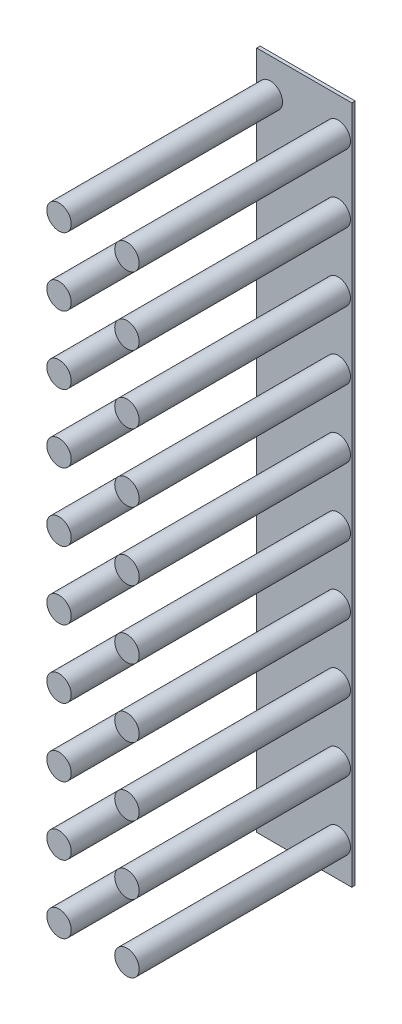
ISO-10303-21;
HEADER;
FILE_DESCRIPTION(('STEP AP214'),'2;1');
FILE_NAME('part.step','',(''),(''),'','','');
FILE_SCHEMA(('AUTOMOTIVE_DESIGN { 1 0 10303 214 1 1 1 1 }'));
ENDSEC;
DATA;
#1=APPLICATION_CONTEXT('core data for automotive mechanical design processes');
#2=APPLICATION_PROTOCOL_DEFINITION('international standard','automotive_design',2000,#1);
#3=PRODUCT_CONTEXT('',#1,'mechanical');
#4=PRODUCT('Part','Part','',(#3));
#5=PRODUCT_RELATED_PRODUCT_CATEGORY('part','',(#4));
#6=PRODUCT_DEFINITION_FORMATION('','',#4);
#7=PRODUCT_DEFINITION_CONTEXT('part definition',#1,'design');
#8=PRODUCT_DEFINITION('design','',#6,#7);
#9=PRODUCT_DEFINITION_SHAPE('','',#8);
#10=(LENGTH_UNIT() NAMED_UNIT(*) SI_UNIT(.MILLI.,.METRE.));
#11=(NAMED_UNIT(*) PLANE_ANGLE_UNIT() SI_UNIT($,.RADIAN.));
#12=(NAMED_UNIT(*) SI_UNIT($,.STERADIAN.) SOLID_ANGLE_UNIT());
#13=UNCERTAINTY_MEASURE_WITH_UNIT(LENGTH_MEASURE(1.E-05),#10,'distance_accuracy_value','');
#14=(GEOMETRIC_REPRESENTATION_CONTEXT(3) GLOBAL_UNCERTAINTY_ASSIGNED_CONTEXT((#13)) GLOBAL_UNIT_ASSIGNED_CONTEXT((#10,
#11,#12)) REPRESENTATION_CONTEXT('',''));
#15=CARTESIAN_POINT('',(0.,0.,0.));
#16=DIRECTION('',(0.,0.,1.));
#17=DIRECTION('',(1.,0.,0.));
#18=AXIS2_PLACEMENT_3D('',#15,#16,#17);
#19=CARTESIAN_POINT('',(19.999999551506,-6.5999998852E-07,4.8387));
#20=DIRECTION('',(4.371138828674E-08,0.,0.999999999999999));
#21=DIRECTION('',(0.999999999999999,0.,-4.371138828674E-08));
#22=AXIS2_PLACEMENT_3D('',#19,#20,#21);
#23=PLANE('',#22);
#24=CARTESIAN_POINT('',(20.6349998013166,-5.715000632243,4.83869997224342));
#25=DIRECTION('',(-4.371138828674E-08,0.,-0.999999999999999));
#26=DIRECTION('',(-0.999999999999999,0.,4.371138828674E-08));
#27=AXIS2_PLACEMENT_3D('',#24,#25,#26);
#28=CIRCLE('',#27,0.2286);
#29=CARTESIAN_POINT('',(20.4063998013166,-5.715000632243,4.83869998223585));
#30=VERTEX_POINT('',#29);
#31=EDGE_CURVE('E20',#30,#30,#28,.T.);
#32=ORIENTED_EDGE('',*,*,#31,.F.);
#33=EDGE_LOOP('',(#32));
#34=FACE_BOUND('',#33,.T.);
#35=ADVANCED_FACE('F17',(#34),#23,.T.);
#36=CARTESIAN_POINT('',(19.999999551506,-6.5999998852E-07,4.8387));
#37=DIRECTION('',(4.371138828674E-08,0.,0.999999999999999));
#38=DIRECTION('',(0.999999999999999,0.,-4.371138828674E-08));
#39=AXIS2_PLACEMENT_3D('',#36,#37,#38);
#40=PLANE('',#39);
#41=CARTESIAN_POINT('',(19.3649998013166,-5.715000687757,4.83870002775642));
#42=DIRECTION('',(-4.371138828674E-08,0.,-0.999999999999999));
#43=DIRECTION('',(-0.999999999999999,0.,4.371138828674E-08));
#44=AXIS2_PLACEMENT_3D('',#41,#42,#43);
#45=CIRCLE('',#44,0.2286);
#46=CARTESIAN_POINT('',(19.1363998013166,-5.715000687757,4.83870003774885));
#47=VERTEX_POINT('',#46);
#48=EDGE_CURVE('E195',#47,#47,#45,.T.);
#49=ORIENTED_EDGE('',*,*,#48,.F.);
#50=EDGE_LOOP('',(#49));
#51=FACE_BOUND('',#50,.T.);
#52=ADVANCED_FACE('F205',(#51),#40,.T.);
#53=CARTESIAN_POINT('',(19.999999551506,-6.5999998852E-07,4.8387));
#54=DIRECTION('',(4.371138828674E-08,0.,0.999999999999999));
#55=DIRECTION('',(0.999999999999999,0.,-4.371138828674E-08));
#56=AXIS2_PLACEMENT_3D('',#53,#54,#55);
#57=PLANE('',#56);
#58=CARTESIAN_POINT('',(20.6349997458036,-4.445000632243,4.83869997224342));
#59=DIRECTION('',(-4.371138828674E-08,0.,-0.999999999999999));
#60=DIRECTION('',(-0.999999999999999,0.,4.371138828674E-08));
#61=AXIS2_PLACEMENT_3D('',#58,#59,#60);
#62=CIRCLE('',#61,0.2286);
#63=CARTESIAN_POINT('',(20.4063997458036,-4.445000632243,4.83869998223585));
#64=VERTEX_POINT('',#63);
#65=EDGE_CURVE('E193',#64,#64,#62,.T.);
#66=ORIENTED_EDGE('',*,*,#65,.F.);
#67=EDGE_LOOP('',(#66));
#68=FACE_BOUND('',#67,.T.);
#69=ADVANCED_FACE('F210',(#68),#57,.T.);
#70=CARTESIAN_POINT('',(19.999999551506,-6.5999998852E-07,4.8387));
#71=DIRECTION('',(4.371138828674E-08,0.,0.999999999999999));
#72=DIRECTION('',(0.999999999999999,0.,-4.371138828674E-08));
#73=AXIS2_PLACEMENT_3D('',#70,#71,#72);
#74=PLANE('',#73);
#75=CARTESIAN_POINT('',(19.3649997458036,-4.445000687757,4.83870002775642));
#76=DIRECTION('',(-4.371138828674E-08,0.,-0.999999999999999));
#77=DIRECTION('',(-0.999999999999999,0.,4.371138828674E-08));
#78=AXIS2_PLACEMENT_3D('',#75,#76,#77);
#79=CIRCLE('',#78,0.2286);
#80=CARTESIAN_POINT('',(19.1363997458036,-4.445000687757,4.83870003774885));
#81=VERTEX_POINT('',#80);
#82=EDGE_CURVE('E190',#81,#81,#79,.T.);
#83=ORIENTED_EDGE('',*,*,#82,.F.);
#84=EDGE_LOOP('',(#83));
#85=FACE_BOUND('',#84,.T.);
#86=ADVANCED_FACE('F375',(#85),#74,.T.);
#87=CARTESIAN_POINT('',(19.999999551506,-6.5999998852E-07,4.8387));
#88=DIRECTION('',(4.371138828674E-08,0.,0.999999999999999));
#89=DIRECTION('',(0.999999999999999,0.,-4.371138828674E-08));
#90=AXIS2_PLACEMENT_3D('',#87,#88,#89);
#91=PLANE('',#90);
#92=CARTESIAN_POINT('',(20.6349996902896,-3.175000632243,4.83869997224342));
#93=DIRECTION('',(-4.371138828674E-08,0.,-0.999999999999999));
#94=DIRECTION('',(-0.999999999999999,0.,4.371138828674E-08));
#95=AXIS2_PLACEMENT_3D('',#92,#93,#94);
#96=CIRCLE('',#95,0.2286);
#97=CARTESIAN_POINT('',(20.4063996902896,-3.175000632243,4.83869998223585));
#98=VERTEX_POINT('',#97);
#99=EDGE_CURVE('E187',#98,#98,#96,.T.);
#100=ORIENTED_EDGE('',*,*,#99,.F.);
#101=EDGE_LOOP('',(#100));
#102=FACE_BOUND('',#101,.T.);
#103=ADVANCED_FACE('F371',(#102),#91,.T.);
#104=CARTESIAN_POINT('',(19.999999551506,-6.5999998852E-07,4.8387));
#105=DIRECTION('',(4.371138828674E-08,0.,0.999999999999999));
#106=DIRECTION('',(0.999999999999999,0.,-4.371138828674E-08));
#107=AXIS2_PLACEMENT_3D('',#104,#105,#106);
#108=PLANE('',#107);
#109=CARTESIAN_POINT('',(19.3649996902896,-3.175000687757,4.83870002775642));
#110=DIRECTION('',(-4.371138828674E-08,0.,-0.999999999999999));
#111=DIRECTION('',(-0.999999999999999,0.,4.371138828674E-08));
#112=AXIS2_PLACEMENT_3D('',#109,#110,#111);
#113=CIRCLE('',#112,0.2286);
#114=CARTESIAN_POINT('',(19.1363996902896,-3.175000687757,4.83870003774885));
#115=VERTEX_POINT('',#114);
#116=EDGE_CURVE('E184',#115,#115,#113,.T.);
#117=ORIENTED_EDGE('',*,*,#116,.F.);
#118=EDGE_LOOP('',(#117));
#119=FACE_BOUND('',#118,.T.);
#120=ADVANCED_FACE('F367',(#119),#108,.T.);
#121=CARTESIAN_POINT('',(19.999999551506,-6.5999998852E-07,4.8387));
#122=DIRECTION('',(4.371138828674E-08,0.,0.999999999999999));
#123=DIRECTION('',(0.999999999999999,0.,-4.371138828674E-08));
#124=AXIS2_PLACEMENT_3D('',#121,#122,#123);
#125=PLANE('',#124);
#126=CARTESIAN_POINT('',(20.6349996347766,-1.905000632243,4.83869997224342));
#127=DIRECTION('',(-4.371138828674E-08,0.,-0.999999999999999));
#128=DIRECTION('',(-0.999999999999999,0.,4.371138828674E-08));
#129=AXIS2_PLACEMENT_3D('',#126,#127,#128);
#130=CIRCLE('',#129,0.2286);
#131=CARTESIAN_POINT('',(20.4063996347766,-1.905000632243,4.83869998223585));
#132=VERTEX_POINT('',#131);
#133=EDGE_CURVE('E181',#132,#132,#130,.T.);
#134=ORIENTED_EDGE('',*,*,#133,.F.);
#135=EDGE_LOOP('',(#134));
#136=FACE_BOUND('',#135,.T.);
#137=ADVANCED_FACE('F363',(#136),#125,.T.);
#138=CARTESIAN_POINT('',(19.999999551506,-6.5999998852E-07,4.8387));
#139=DIRECTION('',(4.371138828674E-08,0.,0.999999999999999));
#140=DIRECTION('',(0.999999999999999,0.,-4.371138828674E-08));
#141=AXIS2_PLACEMENT_3D('',#138,#139,#140);
#142=PLANE('',#141);
#143=CARTESIAN_POINT('',(19.3649996347766,-1.905000687757,4.83870002775642));
#144=DIRECTION('',(-4.371138828674E-08,0.,-0.999999999999999));
#145=DIRECTION('',(-0.999999999999999,0.,4.371138828674E-08));
#146=AXIS2_PLACEMENT_3D('',#143,#144,#145);
#147=CIRCLE('',#146,0.2286);
#148=CARTESIAN_POINT('',(19.1363996347766,-1.905000687757,4.83870003774885));
#149=VERTEX_POINT('',#148);
#150=EDGE_CURVE('E178',#149,#149,#147,.T.);
#151=ORIENTED_EDGE('',*,*,#150,.F.);
#152=EDGE_LOOP('',(#151));
#153=FACE_BOUND('',#152,.T.);
#154=ADVANCED_FACE('F359',(#153),#142,.T.);
#155=CARTESIAN_POINT('',(19.999999551506,-6.5999998852E-07,4.8387));
#156=DIRECTION('',(4.371138828674E-08,0.,0.999999999999999));
#157=DIRECTION('',(0.999999999999999,0.,-4.371138828674E-08));
#158=AXIS2_PLACEMENT_3D('',#155,#156,#157);
#159=PLANE('',#158);
#160=CARTESIAN_POINT('',(20.6349995792626,-0.635000632243003,4.83869997224342));
#161=DIRECTION('',(-4.371138828674E-08,0.,-0.999999999999999));
#162=DIRECTION('',(-0.999999999999999,0.,4.371138828674E-08));
#163=AXIS2_PLACEMENT_3D('',#160,#161,#162);
#164=CIRCLE('',#163,0.2286);
#165=CARTESIAN_POINT('',(20.4063995792626,-0.635000632243003,4.83869998223585));
#166=VERTEX_POINT('',#165);
#167=EDGE_CURVE('E175',#166,#166,#164,.T.);
#168=ORIENTED_EDGE('',*,*,#167,.F.);
#169=EDGE_LOOP('',(#168));
#170=FACE_BOUND('',#169,.T.);
#171=ADVANCED_FACE('F355',(#170),#159,.T.);
#172=CARTESIAN_POINT('',(19.999999551506,-6.5999998852E-07,4.8387));
#173=DIRECTION('',(4.371138828674E-08,0.,0.999999999999999));
#174=DIRECTION('',(0.999999999999999,0.,-4.371138828674E-08));
#175=AXIS2_PLACEMENT_3D('',#172,#173,#174);
#176=PLANE('',#175);
#177=CARTESIAN_POINT('',(19.3649995792626,-0.635000687757003,4.83870002775642));
#178=DIRECTION('',(-4.371138828674E-08,0.,-0.999999999999999));
#179=DIRECTION('',(-0.999999999999999,0.,4.371138828674E-08));
#180=AXIS2_PLACEMENT_3D('',#177,#178,#179);
#181=CIRCLE('',#180,0.2286);
#182=CARTESIAN_POINT('',(19.1363995792626,-0.635000687757003,4.83870003774885));
#183=VERTEX_POINT('',#182);
#184=EDGE_CURVE('E172',#183,#183,#181,.T.);
#185=ORIENTED_EDGE('',*,*,#184,.F.);
#186=EDGE_LOOP('',(#185));
#187=FACE_BOUND('',#186,.T.);
#188=ADVANCED_FACE('F351',(#187),#176,.T.);
#189=CARTESIAN_POINT('',(19.999999551506,-6.5999998852E-07,4.8387));
#190=DIRECTION('',(4.371138828674E-08,0.,0.999999999999999));
#191=DIRECTION('',(0.999999999999999,0.,-4.371138828674E-08));
#192=AXIS2_PLACEMENT_3D('',#189,#190,#191);
#193=PLANE('',#192);
#194=CARTESIAN_POINT('',(20.6349995237496,0.634999367756997,4.83869997224342));
#195=DIRECTION('',(-4.371138828674E-08,0.,-0.999999999999999));
#196=DIRECTION('',(-0.999999999999999,0.,4.371138828674E-08));
#197=AXIS2_PLACEMENT_3D('',#194,#195,#196);
#198=CIRCLE('',#197,0.2286);
#199=CARTESIAN_POINT('',(20.4063995237496,0.634999367756997,4.83869998223585));
#200=VERTEX_POINT('',#199);
#201=EDGE_CURVE('E169',#200,#200,#198,.T.);
#202=ORIENTED_EDGE('',*,*,#201,.F.);
#203=EDGE_LOOP('',(#202));
#204=FACE_BOUND('',#203,.T.);
#205=ADVANCED_FACE('F347',(#204),#193,.T.);
#206=CARTESIAN_POINT('',(19.999999551506,-6.5999998852E-07,4.8387));
#207=DIRECTION('',(4.371138828674E-08,0.,0.999999999999999));
#208=DIRECTION('',(0.999999999999999,0.,-4.371138828674E-08));
#209=AXIS2_PLACEMENT_3D('',#206,#207,#208);
#210=PLANE('',#209);
#211=CARTESIAN_POINT('',(19.3649995237496,0.634999312242997,4.83870002775642));
#212=DIRECTION('',(-4.371138828674E-08,0.,-0.999999999999999));
#213=DIRECTION('',(-0.999999999999999,0.,4.371138828674E-08));
#214=AXIS2_PLACEMENT_3D('',#211,#212,#213);
#215=CIRCLE('',#214,0.2286);
#216=CARTESIAN_POINT('',(19.1363995237496,0.634999312242997,4.83870003774885));
#217=VERTEX_POINT('',#216);
#218=EDGE_CURVE('E166',#217,#217,#215,.T.);
#219=ORIENTED_EDGE('',*,*,#218,.F.);
#220=EDGE_LOOP('',(#219));
#221=FACE_BOUND('',#220,.T.);
#222=ADVANCED_FACE('F343',(#221),#210,.T.);
#223=CARTESIAN_POINT('',(19.999999551506,-6.5999998852E-07,4.8387));
#224=DIRECTION('',(4.371138828674E-08,0.,0.999999999999999));
#225=DIRECTION('',(0.999999999999999,0.,-4.371138828674E-08));
#226=AXIS2_PLACEMENT_3D('',#223,#224,#225);
#227=PLANE('',#226);
#228=CARTESIAN_POINT('',(20.6349994682356,1.904999367757,4.83869997224342));
#229=DIRECTION('',(-4.371138828674E-08,0.,-0.999999999999999));
#230=DIRECTION('',(-0.999999999999999,0.,4.371138828674E-08));
#231=AXIS2_PLACEMENT_3D('',#228,#229,#230);
#232=CIRCLE('',#231,0.2286);
#233=CARTESIAN_POINT('',(20.4063994682356,1.904999367757,4.83869998223585));
#234=VERTEX_POINT('',#233);
#235=EDGE_CURVE('E163',#234,#234,#232,.T.);
#236=ORIENTED_EDGE('',*,*,#235,.F.);
#237=EDGE_LOOP('',(#236));
#238=FACE_BOUND('',#237,.T.);
#239=ADVANCED_FACE('F339',(#238),#227,.T.);
#240=CARTESIAN_POINT('',(19.999999551506,-6.5999998852E-07,4.8387));
#241=DIRECTION('',(4.371138828674E-08,0.,0.999999999999999));
#242=DIRECTION('',(0.999999999999999,0.,-4.371138828674E-08));
#243=AXIS2_PLACEMENT_3D('',#240,#241,#242);
#244=PLANE('',#243);
#245=CARTESIAN_POINT('',(19.3649994682356,1.904999312243,4.83870002775642));
#246=DIRECTION('',(-4.371138828674E-08,0.,-0.999999999999999));
#247=DIRECTION('',(-0.999999999999999,0.,4.371138828674E-08));
#248=AXIS2_PLACEMENT_3D('',#245,#246,#247);
#249=CIRCLE('',#248,0.2286);
#250=CARTESIAN_POINT('',(19.1363994682356,1.904999312243,4.83870003774885));
#251=VERTEX_POINT('',#250);
#252=EDGE_CURVE('E160',#251,#251,#249,.T.);
#253=ORIENTED_EDGE('',*,*,#252,.F.);
#254=EDGE_LOOP('',(#253));
#255=FACE_BOUND('',#254,.T.);
#256=ADVANCED_FACE('F335',(#255),#244,.T.);
#257=CARTESIAN_POINT('',(19.999999551506,-6.5999998852E-07,4.8387));
#258=DIRECTION('',(4.371138828674E-08,0.,0.999999999999999));
#259=DIRECTION('',(0.999999999999999,0.,-4.371138828674E-08));
#260=AXIS2_PLACEMENT_3D('',#257,#258,#259);
#261=PLANE('',#260);
#262=CARTESIAN_POINT('',(20.6349994127226,3.174999367757,4.83869997224342));
#263=DIRECTION('',(-4.371138828674E-08,0.,-0.999999999999999));
#264=DIRECTION('',(-0.999999999999999,0.,4.371138828674E-08));
#265=AXIS2_PLACEMENT_3D('',#262,#263,#264);
#266=CIRCLE('',#265,0.2286);
#267=CARTESIAN_POINT('',(20.4063994127226,3.174999367757,4.83869998223585));
#268=VERTEX_POINT('',#267);
#269=EDGE_CURVE('E157',#268,#268,#266,.T.);
#270=ORIENTED_EDGE('',*,*,#269,.F.);
#271=EDGE_LOOP('',(#270));
#272=FACE_BOUND('',#271,.T.);
#273=ADVANCED_FACE('F331',(#272),#261,.T.);
#274=CARTESIAN_POINT('',(19.999999551506,-6.5999998852E-07,4.8387));
#275=DIRECTION('',(4.371138828674E-08,0.,0.999999999999999));
#276=DIRECTION('',(0.999999999999999,0.,-4.371138828674E-08));
#277=AXIS2_PLACEMENT_3D('',#274,#275,#276);
#278=PLANE('',#277);
#279=CARTESIAN_POINT('',(19.3649994127226,3.174999312243,4.83870002775642));
#280=DIRECTION('',(-4.371138828674E-08,0.,-0.999999999999999));
#281=DIRECTION('',(-0.999999999999999,0.,4.371138828674E-08));
#282=AXIS2_PLACEMENT_3D('',#279,#280,#281);
#283=CIRCLE('',#282,0.2286);
#284=CARTESIAN_POINT('',(19.1363994127226,3.174999312243,4.83870003774885));
#285=VERTEX_POINT('',#284);
#286=EDGE_CURVE('E154',#285,#285,#283,.T.);
#287=ORIENTED_EDGE('',*,*,#286,.F.);
#288=EDGE_LOOP('',(#287));
#289=FACE_BOUND('',#288,.T.);
#290=ADVANCED_FACE('F327',(#289),#278,.T.);
#291=CARTESIAN_POINT('',(19.999999551506,-6.5999998852E-07,4.8387));
#292=DIRECTION('',(4.371138828674E-08,0.,0.999999999999999));
#293=DIRECTION('',(0.999999999999999,0.,-4.371138828674E-08));
#294=AXIS2_PLACEMENT_3D('',#291,#292,#293);
#295=PLANE('',#294);
#296=CARTESIAN_POINT('',(20.6349993572096,4.444999367757,4.83869997224342));
#297=DIRECTION('',(-4.371138828674E-08,0.,-0.999999999999999));
#298=DIRECTION('',(-0.999999999999999,0.,4.371138828674E-08));
#299=AXIS2_PLACEMENT_3D('',#296,#297,#298);
#300=CIRCLE('',#299,0.2286);
#301=CARTESIAN_POINT('',(20.4063993572096,4.444999367757,4.83869998223585));
#302=VERTEX_POINT('',#301);
#303=EDGE_CURVE('E151',#302,#302,#300,.T.);
#304=ORIENTED_EDGE('',*,*,#303,.F.);
#305=EDGE_LOOP('',(#304));
#306=FACE_BOUND('',#305,.T.);
#307=ADVANCED_FACE('F323',(#306),#295,.T.);
#308=CARTESIAN_POINT('',(19.999999551506,-6.5999998852E-07,4.8387));
#309=DIRECTION('',(4.371138828674E-08,0.,0.999999999999999));
#310=DIRECTION('',(0.999999999999999,0.,-4.371138828674E-08));
#311=AXIS2_PLACEMENT_3D('',#308,#309,#310);
#312=PLANE('',#311);
#313=CARTESIAN_POINT('',(19.3649993572096,4.444999312243,4.83870002775642));
#314=DIRECTION('',(-4.371138828674E-08,0.,-0.999999999999999));
#315=DIRECTION('',(-0.999999999999999,0.,4.371138828674E-08));
#316=AXIS2_PLACEMENT_3D('',#313,#314,#315);
#317=CIRCLE('',#316,0.2286);
#318=CARTESIAN_POINT('',(19.1363993572096,4.444999312243,4.83870003774885));
#319=VERTEX_POINT('',#318);
#320=EDGE_CURVE('E148',#319,#319,#317,.T.);
#321=ORIENTED_EDGE('',*,*,#320,.F.);
#322=EDGE_LOOP('',(#321));
#323=FACE_BOUND('',#322,.T.);
#324=ADVANCED_FACE('F319',(#323),#312,.T.);
#325=CARTESIAN_POINT('',(19.999999551506,-6.5999998852E-07,4.8387));
#326=DIRECTION('',(4.371138828674E-08,0.,0.999999999999999));
#327=DIRECTION('',(0.999999999999999,0.,-4.371138828674E-08));
#328=AXIS2_PLACEMENT_3D('',#325,#326,#327);
#329=PLANE('',#328);
#330=CARTESIAN_POINT('',(20.6349993016956,5.714999367757,4.83869997224342));
#331=DIRECTION('',(-4.371138828674E-08,0.,-0.999999999999999));
#332=DIRECTION('',(-0.999999999999999,0.,4.371138828674E-08));
#333=AXIS2_PLACEMENT_3D('',#330,#331,#332);
#334=CIRCLE('',#333,0.2286);
#335=CARTESIAN_POINT('',(20.4063993016956,5.714999367757,4.83869998223585));
#336=VERTEX_POINT('',#335);
#337=EDGE_CURVE('E145',#336,#336,#334,.T.);
#338=ORIENTED_EDGE('',*,*,#337,.F.);
#339=EDGE_LOOP('',(#338));
#340=FACE_BOUND('',#339,.T.);
#341=ADVANCED_FACE('F315',(#340),#329,.T.);
#342=CARTESIAN_POINT('',(19.999999551506,-6.5999998852E-07,4.8387));
#343=DIRECTION('',(4.371138828674E-08,0.,0.999999999999999));
#344=DIRECTION('',(0.999999999999999,0.,-4.371138828674E-08));
#345=AXIS2_PLACEMENT_3D('',#342,#343,#344);
#346=PLANE('',#345);
#347=CARTESIAN_POINT('',(19.3649993016956,5.714999312243,4.83870002775642));
#348=DIRECTION('',(-4.371138828674E-08,0.,-0.999999999999999));
#349=DIRECTION('',(-0.999999999999999,0.,4.371138828674E-08));
#350=AXIS2_PLACEMENT_3D('',#347,#348,#349);
#351=CIRCLE('',#350,0.2286);
#352=CARTESIAN_POINT('',(19.1363993016956,5.714999312243,4.83870003774885));
#353=VERTEX_POINT('',#352);
#354=EDGE_CURVE('E142',#353,#353,#351,.T.);
#355=ORIENTED_EDGE('',*,*,#354,.F.);
#356=EDGE_LOOP('',(#355));
#357=FACE_BOUND('',#356,.T.);
#358=ADVANCED_FACE('F311',(#357),#346,.T.);
#359=CARTESIAN_POINT('',(20.634999872929,-5.715000632243,6.476999972243));
#360=DIRECTION('',(-4.371138828674E-08,0.,-0.999999999999999));
#361=DIRECTION('',(-0.999999999999999,0.,4.371138828674E-08));
#362=AXIS2_PLACEMENT_3D('',#359,#360,#361);
#363=CYLINDRICAL_SURFACE('',#362,0.2286);
#364=CARTESIAN_POINT('',(20.6349996286698,-5.71500063224301,0.888999972243));
#365=DIRECTION('',(-4.371138828674E-08,0.,-0.999999999999999));
#366=DIRECTION('',(-0.999999999999999,0.,4.371138828674E-08));
#367=AXIS2_PLACEMENT_3D('',#364,#365,#366);
#368=CIRCLE('',#367,0.2286);
#369=CARTESIAN_POINT('',(20.4063996286698,-5.71500063224301,0.888999982235424));
#370=VERTEX_POINT('',#369);
#371=EDGE_CURVE('E139',#370,#370,#368,.T.);
#372=ORIENTED_EDGE('',*,*,#371,.F.);
#373=EDGE_LOOP('',(#372));
#374=FACE_BOUND('',#373,.T.);
#375=ORIENTED_EDGE('',*,*,#31,.T.);
#376=EDGE_LOOP('',(#375));
#377=FACE_BOUND('',#376,.T.);
#378=ADVANCED_FACE('F202',(#374,#377),#363,.T.);
#379=CARTESIAN_POINT('',(19.364999872929,-5.715000687757,6.477000027757));
#380=DIRECTION('',(-4.371138828674E-08,0.,-0.999999999999999));
#381=DIRECTION('',(-0.999999999999999,0.,4.371138828674E-08));
#382=AXIS2_PLACEMENT_3D('',#379,#380,#381);
#383=CYLINDRICAL_SURFACE('',#382,0.2286);
#384=CARTESIAN_POINT('',(19.3649996286698,-5.71500068775701,0.889000027757));
#385=DIRECTION('',(-4.371138828674E-08,0.,-0.999999999999999));
#386=DIRECTION('',(-0.999999999999999,0.,4.371138828674E-08));
#387=AXIS2_PLACEMENT_3D('',#384,#385,#386);
#388=CIRCLE('',#387,0.2286);
#389=CARTESIAN_POINT('',(19.1363996286698,-5.71500068775701,0.889000037749423));
#390=VERTEX_POINT('',#389);
#391=EDGE_CURVE('E136',#390,#390,#388,.T.);
#392=ORIENTED_EDGE('',*,*,#391,.F.);
#393=EDGE_LOOP('',(#392));
#394=FACE_BOUND('',#393,.T.);
#395=ORIENTED_EDGE('',*,*,#48,.T.);
#396=EDGE_LOOP('',(#395));
#397=FACE_BOUND('',#396,.T.);
#398=ADVANCED_FACE('F304',(#394,#397),#383,.T.);
#399=CARTESIAN_POINT('',(20.634999817416,-4.445000632243,6.476999972243));
#400=DIRECTION('',(-4.371138828674E-08,0.,-0.999999999999999));
#401=DIRECTION('',(-0.999999999999999,0.,4.371138828674E-08));
#402=AXIS2_PLACEMENT_3D('',#399,#400,#401);
#403=CYLINDRICAL_SURFACE('',#402,0.2286);
#404=CARTESIAN_POINT('',(20.6349995731568,-4.44500063224301,0.888999972243));
#405=DIRECTION('',(-4.371138828674E-08,0.,-0.999999999999999));
#406=DIRECTION('',(-0.999999999999999,0.,4.371138828674E-08));
#407=AXIS2_PLACEMENT_3D('',#404,#405,#406);
#408=CIRCLE('',#407,0.2286);
#409=CARTESIAN_POINT('',(20.4063995731568,-4.44500063224301,0.888999982235424));
#410=VERTEX_POINT('',#409);
#411=EDGE_CURVE('E133',#410,#410,#408,.T.);
#412=ORIENTED_EDGE('',*,*,#411,.F.);
#413=EDGE_LOOP('',(#412));
#414=FACE_BOUND('',#413,.T.);
#415=ORIENTED_EDGE('',*,*,#65,.T.);
#416=EDGE_LOOP('',(#415));
#417=FACE_BOUND('',#416,.T.);
#418=ADVANCED_FACE('F300',(#414,#417),#403,.T.);
#419=CARTESIAN_POINT('',(19.364999817416,-4.445000687757,6.477000027757));
#420=DIRECTION('',(-4.371138828674E-08,0.,-0.999999999999999));
#421=DIRECTION('',(-0.999999999999999,0.,4.371138828674E-08));
#422=AXIS2_PLACEMENT_3D('',#419,#420,#421);
#423=CYLINDRICAL_SURFACE('',#422,0.2286);
#424=CARTESIAN_POINT('',(19.3649995731568,-4.44500068775701,0.889000027757));
#425=DIRECTION('',(-4.371138828674E-08,0.,-0.999999999999999));
#426=DIRECTION('',(-0.999999999999999,0.,4.371138828674E-08));
#427=AXIS2_PLACEMENT_3D('',#424,#425,#426);
#428=CIRCLE('',#427,0.2286);
#429=CARTESIAN_POINT('',(19.1363995731568,-4.44500068775701,0.889000037749423));
#430=VERTEX_POINT('',#429);
#431=EDGE_CURVE('E130',#430,#430,#428,.T.);
#432=ORIENTED_EDGE('',*,*,#431,.F.);
#433=EDGE_LOOP('',(#432));
#434=FACE_BOUND('',#433,.T.);
#435=ORIENTED_EDGE('',*,*,#82,.T.);
#436=EDGE_LOOP('',(#435));
#437=FACE_BOUND('',#436,.T.);
#438=ADVANCED_FACE('F296',(#434,#437),#423,.T.);
#439=CARTESIAN_POINT('',(20.634999761902,-3.175000632243,6.476999972243));
#440=DIRECTION('',(-4.371138828674E-08,0.,-0.999999999999999));
#441=DIRECTION('',(-0.999999999999999,0.,4.371138828674E-08));
#442=AXIS2_PLACEMENT_3D('',#439,#440,#441);
#443=CYLINDRICAL_SURFACE('',#442,0.2286);
#444=CARTESIAN_POINT('',(20.6349995176428,-3.17500063224301,0.888999972243));
#445=DIRECTION('',(-4.371138828674E-08,0.,-0.999999999999999));
#446=DIRECTION('',(-0.999999999999999,0.,4.371138828674E-08));
#447=AXIS2_PLACEMENT_3D('',#444,#445,#446);
#448=CIRCLE('',#447,0.2286);
#449=CARTESIAN_POINT('',(20.4063995176428,-3.17500063224301,0.888999982235424));
#450=VERTEX_POINT('',#449);
#451=EDGE_CURVE('E127',#450,#450,#448,.T.);
#452=ORIENTED_EDGE('',*,*,#451,.F.);
#453=EDGE_LOOP('',(#452));
#454=FACE_BOUND('',#453,.T.);
#455=ORIENTED_EDGE('',*,*,#99,.T.);
#456=EDGE_LOOP('',(#455));
#457=FACE_BOUND('',#456,.T.);
#458=ADVANCED_FACE('F292',(#454,#457),#443,.T.);
#459=CARTESIAN_POINT('',(19.364999761902,-3.175000687757,6.477000027757));
#460=DIRECTION('',(-4.371138828674E-08,0.,-0.999999999999999));
#461=DIRECTION('',(-0.999999999999999,0.,4.371138828674E-08));
#462=AXIS2_PLACEMENT_3D('',#459,#460,#461);
#463=CYLINDRICAL_SURFACE('',#462,0.2286);
#464=CARTESIAN_POINT('',(19.3649995176428,-3.17500068775701,0.889000027757));
#465=DIRECTION('',(-4.371138828674E-08,0.,-0.999999999999999));
#466=DIRECTION('',(-0.999999999999999,0.,4.371138828674E-08));
#467=AXIS2_PLACEMENT_3D('',#464,#465,#466);
#468=CIRCLE('',#467,0.2286);
#469=CARTESIAN_POINT('',(19.1363995176428,-3.17500068775701,0.889000037749423));
#470=VERTEX_POINT('',#469);
#471=EDGE_CURVE('E124',#470,#470,#468,.T.);
#472=ORIENTED_EDGE('',*,*,#471,.F.);
#473=EDGE_LOOP('',(#472));
#474=FACE_BOUND('',#473,.T.);
#475=ORIENTED_EDGE('',*,*,#116,.T.);
#476=EDGE_LOOP('',(#475));
#477=FACE_BOUND('',#476,.T.);
#478=ADVANCED_FACE('F288',(#474,#477),#463,.T.);
#479=CARTESIAN_POINT('',(20.634999706389,-1.905000632243,6.476999972243));
#480=DIRECTION('',(-4.371138828674E-08,0.,-0.999999999999999));
#481=DIRECTION('',(-0.999999999999999,0.,4.371138828674E-08));
#482=AXIS2_PLACEMENT_3D('',#479,#480,#481);
#483=CYLINDRICAL_SURFACE('',#482,0.2286);
#484=CARTESIAN_POINT('',(20.6349994621298,-1.90500063224301,0.888999972243));
#485=DIRECTION('',(-4.371138828674E-08,0.,-0.999999999999999));
#486=DIRECTION('',(-0.999999999999999,0.,4.371138828674E-08));
#487=AXIS2_PLACEMENT_3D('',#484,#485,#486);
#488=CIRCLE('',#487,0.2286);
#489=CARTESIAN_POINT('',(20.4063994621298,-1.90500063224301,0.888999982235424));
#490=VERTEX_POINT('',#489);
#491=EDGE_CURVE('E121',#490,#490,#488,.T.);
#492=ORIENTED_EDGE('',*,*,#491,.F.);
#493=EDGE_LOOP('',(#492));
#494=FACE_BOUND('',#493,.T.);
#495=ORIENTED_EDGE('',*,*,#133,.T.);
#496=EDGE_LOOP('',(#495));
#497=FACE_BOUND('',#496,.T.);
#498=ADVANCED_FACE('F284',(#494,#497),#483,.T.);
#499=CARTESIAN_POINT('',(19.364999706389,-1.905000687757,6.477000027757));
#500=DIRECTION('',(-4.371138828674E-08,0.,-0.999999999999999));
#501=DIRECTION('',(-0.999999999999999,0.,4.371138828674E-08));
#502=AXIS2_PLACEMENT_3D('',#499,#500,#501);
#503=CYLINDRICAL_SURFACE('',#502,0.2286);
#504=CARTESIAN_POINT('',(19.3649994621298,-1.90500068775701,0.889000027757));
#505=DIRECTION('',(-4.371138828674E-08,0.,-0.999999999999999));
#506=DIRECTION('',(-0.999999999999999,0.,4.371138828674E-08));
#507=AXIS2_PLACEMENT_3D('',#504,#505,#506);
#508=CIRCLE('',#507,0.2286);
#509=CARTESIAN_POINT('',(19.1363994621298,-1.90500068775701,0.889000037749423));
#510=VERTEX_POINT('',#509);
#511=EDGE_CURVE('E118',#510,#510,#508,.T.);
#512=ORIENTED_EDGE('',*,*,#511,.F.);
#513=EDGE_LOOP('',(#512));
#514=FACE_BOUND('',#513,.T.);
#515=ORIENTED_EDGE('',*,*,#150,.T.);
#516=EDGE_LOOP('',(#515));
#517=FACE_BOUND('',#516,.T.);
#518=ADVANCED_FACE('F280',(#514,#517),#503,.T.);
#519=CARTESIAN_POINT('',(20.634999650875,-0.635000632243,6.476999972243));
#520=DIRECTION('',(-4.371138828674E-08,0.,-0.999999999999999));
#521=DIRECTION('',(-0.999999999999999,0.,4.371138828674E-08));
#522=AXIS2_PLACEMENT_3D('',#519,#520,#521);
#523=CYLINDRICAL_SURFACE('',#522,0.2286);
#524=CARTESIAN_POINT('',(20.6349994066158,-0.635000632243011,0.888999972243));
#525=DIRECTION('',(-4.371138828674E-08,0.,-0.999999999999999));
#526=DIRECTION('',(-0.999999999999999,0.,4.371138828674E-08));
#527=AXIS2_PLACEMENT_3D('',#524,#525,#526);
#528=CIRCLE('',#527,0.2286);
#529=CARTESIAN_POINT('',(20.4063994066158,-0.635000632243011,0.888999982235424));
#530=VERTEX_POINT('',#529);
#531=EDGE_CURVE('E115',#530,#530,#528,.T.);
#532=ORIENTED_EDGE('',*,*,#531,.F.);
#533=EDGE_LOOP('',(#532));
#534=FACE_BOUND('',#533,.T.);
#535=ORIENTED_EDGE('',*,*,#167,.T.);
#536=EDGE_LOOP('',(#535));
#537=FACE_BOUND('',#536,.T.);
#538=ADVANCED_FACE('F276',(#534,#537),#523,.T.);
#539=CARTESIAN_POINT('',(19.364999650875,-0.635000687757,6.477000027757));
#540=DIRECTION('',(-4.371138828674E-08,0.,-0.999999999999999));
#541=DIRECTION('',(-0.999999999999999,0.,4.371138828674E-08));
#542=AXIS2_PLACEMENT_3D('',#539,#540,#541);
#543=CYLINDRICAL_SURFACE('',#542,0.2286);
#544=CARTESIAN_POINT('',(19.3649994066158,-0.635000687757011,0.889000027757));
#545=DIRECTION('',(-4.371138828674E-08,0.,-0.999999999999999));
#546=DIRECTION('',(-0.999999999999999,0.,4.371138828674E-08));
#547=AXIS2_PLACEMENT_3D('',#544,#545,#546);
#548=CIRCLE('',#547,0.2286);
#549=CARTESIAN_POINT('',(19.1363994066158,-0.635000687757011,0.889000037749423));
#550=VERTEX_POINT('',#549);
#551=EDGE_CURVE('E112',#550,#550,#548,.T.);
#552=ORIENTED_EDGE('',*,*,#551,.F.);
#553=EDGE_LOOP('',(#552));
#554=FACE_BOUND('',#553,.T.);
#555=ORIENTED_EDGE('',*,*,#184,.T.);
#556=EDGE_LOOP('',(#555));
#557=FACE_BOUND('',#556,.T.);
#558=ADVANCED_FACE('F272',(#554,#557),#543,.T.);
#559=CARTESIAN_POINT('',(20.634999595362,0.634999367757,6.476999972243));
#560=DIRECTION('',(-4.371138828674E-08,0.,-0.999999999999999));
#561=DIRECTION('',(-0.999999999999999,0.,4.371138828674E-08));
#562=AXIS2_PLACEMENT_3D('',#559,#560,#561);
#563=CYLINDRICAL_SURFACE('',#562,0.2286);
#564=CARTESIAN_POINT('',(20.6349993511028,0.63499936775699,0.888999972243));
#565=DIRECTION('',(-4.371138828674E-08,0.,-0.999999999999999));
#566=DIRECTION('',(-0.999999999999999,0.,4.371138828674E-08));
#567=AXIS2_PLACEMENT_3D('',#564,#565,#566);
#568=CIRCLE('',#567,0.2286);
#569=CARTESIAN_POINT('',(20.4063993511028,0.63499936775699,0.888999982235424));
#570=VERTEX_POINT('',#569);
#571=EDGE_CURVE('E109',#570,#570,#568,.T.);
#572=ORIENTED_EDGE('',*,*,#571,.F.);
#573=EDGE_LOOP('',(#572));
#574=FACE_BOUND('',#573,.T.);
#575=ORIENTED_EDGE('',*,*,#201,.T.);
#576=EDGE_LOOP('',(#575));
#577=FACE_BOUND('',#576,.T.);
#578=ADVANCED_FACE('F268',(#574,#577),#563,.T.);
#579=CARTESIAN_POINT('',(19.364999595362,0.634999312243,6.477000027757));
#580=DIRECTION('',(-4.371138828674E-08,0.,-0.999999999999999));
#581=DIRECTION('',(-0.999999999999999,0.,4.371138828674E-08));
#582=AXIS2_PLACEMENT_3D('',#579,#580,#581);
#583=CYLINDRICAL_SURFACE('',#582,0.2286);
#584=CARTESIAN_POINT('',(19.3649993511028,0.634999312242989,0.889000027757));
#585=DIRECTION('',(-4.371138828674E-08,0.,-0.999999999999999));
#586=DIRECTION('',(-0.999999999999999,0.,4.371138828674E-08));
#587=AXIS2_PLACEMENT_3D('',#584,#585,#586);
#588=CIRCLE('',#587,0.2286);
#589=CARTESIAN_POINT('',(19.1363993511028,0.634999312242989,0.889000037749423));
#590=VERTEX_POINT('',#589);
#591=EDGE_CURVE('E106',#590,#590,#588,.T.);
#592=ORIENTED_EDGE('',*,*,#591,.F.);
#593=EDGE_LOOP('',(#592));
#594=FACE_BOUND('',#593,.T.);
#595=ORIENTED_EDGE('',*,*,#218,.T.);
#596=EDGE_LOOP('',(#595));
#597=FACE_BOUND('',#596,.T.);
#598=ADVANCED_FACE('F264',(#594,#597),#583,.T.);
#599=CARTESIAN_POINT('',(20.634999539848,1.904999367757,6.476999972243));
#600=DIRECTION('',(-4.371138828674E-08,0.,-0.999999999999999));
#601=DIRECTION('',(-0.999999999999999,0.,4.371138828674E-08));
#602=AXIS2_PLACEMENT_3D('',#599,#600,#601);
#603=CYLINDRICAL_SURFACE('',#602,0.2286);
#604=CARTESIAN_POINT('',(20.6349992955888,1.90499936775699,0.888999972243));
#605=DIRECTION('',(-4.371138828674E-08,0.,-0.999999999999999));
#606=DIRECTION('',(-0.999999999999999,0.,4.371138828674E-08));
#607=AXIS2_PLACEMENT_3D('',#604,#605,#606);
#608=CIRCLE('',#607,0.2286);
#609=CARTESIAN_POINT('',(20.4063992955888,1.90499936775699,0.888999982235424));
#610=VERTEX_POINT('',#609);
#611=EDGE_CURVE('E103',#610,#610,#608,.T.);
#612=ORIENTED_EDGE('',*,*,#611,.F.);
#613=EDGE_LOOP('',(#612));
#614=FACE_BOUND('',#613,.T.);
#615=ORIENTED_EDGE('',*,*,#235,.T.);
#616=EDGE_LOOP('',(#615));
#617=FACE_BOUND('',#616,.T.);
#618=ADVANCED_FACE('F260',(#614,#617),#603,.T.);
#619=CARTESIAN_POINT('',(19.364999539848,1.904999312243,6.477000027757));
#620=DIRECTION('',(-4.371138828674E-08,0.,-0.999999999999999));
#621=DIRECTION('',(-0.999999999999999,0.,4.371138828674E-08));
#622=AXIS2_PLACEMENT_3D('',#619,#620,#621);
#623=CYLINDRICAL_SURFACE('',#622,0.2286);
#624=CARTESIAN_POINT('',(19.3649992955888,1.90499931224299,0.889000027757));
#625=DIRECTION('',(-4.371138828674E-08,0.,-0.999999999999999));
#626=DIRECTION('',(-0.999999999999999,0.,4.371138828674E-08));
#627=AXIS2_PLACEMENT_3D('',#624,#625,#626);
#628=CIRCLE('',#627,0.2286);
#629=CARTESIAN_POINT('',(19.1363992955888,1.90499931224299,0.889000037749423));
#630=VERTEX_POINT('',#629);
#631=EDGE_CURVE('E100',#630,#630,#628,.T.);
#632=ORIENTED_EDGE('',*,*,#631,.F.);
#633=EDGE_LOOP('',(#632));
#634=FACE_BOUND('',#633,.T.);
#635=ORIENTED_EDGE('',*,*,#252,.T.);
#636=EDGE_LOOP('',(#635));
#637=FACE_BOUND('',#636,.T.);
#638=ADVANCED_FACE('F256',(#634,#637),#623,.T.);
#639=CARTESIAN_POINT('',(20.634999484335,3.174999367757,6.476999972243));
#640=DIRECTION('',(-4.371138828674E-08,0.,-0.999999999999999));
#641=DIRECTION('',(-0.999999999999999,0.,4.371138828674E-08));
#642=AXIS2_PLACEMENT_3D('',#639,#640,#641);
#643=CYLINDRICAL_SURFACE('',#642,0.2286);
#644=CARTESIAN_POINT('',(20.6349992400758,3.17499936775699,0.888999972243));
#645=DIRECTION('',(-4.371138828674E-08,0.,-0.999999999999999));
#646=DIRECTION('',(-0.999999999999999,0.,4.371138828674E-08));
#647=AXIS2_PLACEMENT_3D('',#644,#645,#646);
#648=CIRCLE('',#647,0.2286);
#649=CARTESIAN_POINT('',(20.4063992400758,3.17499936775699,0.888999982235424));
#650=VERTEX_POINT('',#649);
#651=EDGE_CURVE('E97',#650,#650,#648,.T.);
#652=ORIENTED_EDGE('',*,*,#651,.F.);
#653=EDGE_LOOP('',(#652));
#654=FACE_BOUND('',#653,.T.);
#655=ORIENTED_EDGE('',*,*,#269,.T.);
#656=EDGE_LOOP('',(#655));
#657=FACE_BOUND('',#656,.T.);
#658=ADVANCED_FACE('F252',(#654,#657),#643,.T.);
#659=CARTESIAN_POINT('',(19.364999484335,3.174999312243,6.477000027757));
#660=DIRECTION('',(-4.371138828674E-08,0.,-0.999999999999999));
#661=DIRECTION('',(-0.999999999999999,0.,4.371138828674E-08));
#662=AXIS2_PLACEMENT_3D('',#659,#660,#661);
#663=CYLINDRICAL_SURFACE('',#662,0.2286);
#664=CARTESIAN_POINT('',(19.3649992400758,3.17499931224299,0.889000027757));
#665=DIRECTION('',(-4.371138828674E-08,0.,-0.999999999999999));
#666=DIRECTION('',(-0.999999999999999,0.,4.371138828674E-08));
#667=AXIS2_PLACEMENT_3D('',#664,#665,#666);
#668=CIRCLE('',#667,0.2286);
#669=CARTESIAN_POINT('',(19.1363992400758,3.17499931224299,0.889000037749423));
#670=VERTEX_POINT('',#669);
#671=EDGE_CURVE('E94',#670,#670,#668,.T.);
#672=ORIENTED_EDGE('',*,*,#671,.F.);
#673=EDGE_LOOP('',(#672));
#674=FACE_BOUND('',#673,.T.);
#675=ORIENTED_EDGE('',*,*,#286,.T.);
#676=EDGE_LOOP('',(#675));
#677=FACE_BOUND('',#676,.T.);
#678=ADVANCED_FACE('F248',(#674,#677),#663,.T.);
#679=CARTESIAN_POINT('',(20.634999428822,4.444999367757,6.476999972243));
#680=DIRECTION('',(-4.371138828674E-08,0.,-0.999999999999999));
#681=DIRECTION('',(-0.999999999999999,0.,4.371138828674E-08));
#682=AXIS2_PLACEMENT_3D('',#679,#680,#681);
#683=CYLINDRICAL_SURFACE('',#682,0.2286);
#684=CARTESIAN_POINT('',(20.6349991845628,4.44499936775699,0.888999972243));
#685=DIRECTION('',(-4.371138828674E-08,0.,-0.999999999999999));
#686=DIRECTION('',(-0.999999999999999,0.,4.371138828674E-08));
#687=AXIS2_PLACEMENT_3D('',#684,#685,#686);
#688=CIRCLE('',#687,0.2286);
#689=CARTESIAN_POINT('',(20.4063991845628,4.44499936775699,0.888999982235424));
#690=VERTEX_POINT('',#689);
#691=EDGE_CURVE('E91',#690,#690,#688,.T.);
#692=ORIENTED_EDGE('',*,*,#691,.F.);
#693=EDGE_LOOP('',(#692));
#694=FACE_BOUND('',#693,.T.);
#695=ORIENTED_EDGE('',*,*,#303,.T.);
#696=EDGE_LOOP('',(#695));
#697=FACE_BOUND('',#696,.T.);
#698=ADVANCED_FACE('F244',(#694,#697),#683,.T.);
#699=CARTESIAN_POINT('',(19.364999428822,4.444999312243,6.477000027757));
#700=DIRECTION('',(-4.371138828674E-08,0.,-0.999999999999999));
#701=DIRECTION('',(-0.999999999999999,0.,4.371138828674E-08));
#702=AXIS2_PLACEMENT_3D('',#699,#700,#701);
#703=CYLINDRICAL_SURFACE('',#702,0.2286);
#704=CARTESIAN_POINT('',(19.3649991845628,4.44499931224299,0.889000027757));
#705=DIRECTION('',(-4.371138828674E-08,0.,-0.999999999999999));
#706=DIRECTION('',(-0.999999999999999,0.,4.371138828674E-08));
#707=AXIS2_PLACEMENT_3D('',#704,#705,#706);
#708=CIRCLE('',#707,0.2286);
#709=CARTESIAN_POINT('',(19.1363991845628,4.44499931224299,0.889000037749423));
#710=VERTEX_POINT('',#709);
#711=EDGE_CURVE('E88',#710,#710,#708,.T.);
#712=ORIENTED_EDGE('',*,*,#711,.F.);
#713=EDGE_LOOP('',(#712));
#714=FACE_BOUND('',#713,.T.);
#715=ORIENTED_EDGE('',*,*,#320,.T.);
#716=EDGE_LOOP('',(#715));
#717=FACE_BOUND('',#716,.T.);
#718=ADVANCED_FACE('F240',(#714,#717),#703,.T.);
#719=CARTESIAN_POINT('',(20.634999373308,5.714999367757,6.476999972243));
#720=DIRECTION('',(-4.371138828674E-08,0.,-0.999999999999999));
#721=DIRECTION('',(-0.999999999999999,0.,4.371138828674E-08));
#722=AXIS2_PLACEMENT_3D('',#719,#720,#721);
#723=CYLINDRICAL_SURFACE('',#722,0.2286);
#724=CARTESIAN_POINT('',(20.6349991290488,5.71499936775699,0.888999972243));
#725=DIRECTION('',(-4.371138828674E-08,0.,-0.999999999999999));
#726=DIRECTION('',(-0.999999999999999,0.,4.371138828674E-08));
#727=AXIS2_PLACEMENT_3D('',#724,#725,#726);
#728=CIRCLE('',#727,0.2286);
#729=CARTESIAN_POINT('',(20.4063991290488,5.71499936775699,0.888999982235424));
#730=VERTEX_POINT('',#729);
#731=EDGE_CURVE('E85',#730,#730,#728,.T.);
#732=ORIENTED_EDGE('',*,*,#731,.F.);
#733=EDGE_LOOP('',(#732));
#734=FACE_BOUND('',#733,.T.);
#735=ORIENTED_EDGE('',*,*,#337,.T.);
#736=EDGE_LOOP('',(#735));
#737=FACE_BOUND('',#736,.T.);
#738=ADVANCED_FACE('F236',(#734,#737),#723,.T.);
#739=CARTESIAN_POINT('',(19.364999373308,5.714999312243,6.477000027757));
#740=DIRECTION('',(-4.371138828674E-08,0.,-0.999999999999999));
#741=DIRECTION('',(-0.999999999999999,0.,4.371138828674E-08));
#742=AXIS2_PLACEMENT_3D('',#739,#740,#741);
#743=CYLINDRICAL_SURFACE('',#742,0.2286);
#744=CARTESIAN_POINT('',(19.3649991290488,5.71499931224299,0.889000027757));
#745=DIRECTION('',(-4.371138828674E-08,0.,-0.999999999999999));
#746=DIRECTION('',(-0.999999999999999,0.,4.371138828674E-08));
#747=AXIS2_PLACEMENT_3D('',#744,#745,#746);
#748=CIRCLE('',#747,0.2286);
#749=CARTESIAN_POINT('',(19.1363991290488,5.71499931224299,0.889000037749423));
#750=VERTEX_POINT('',#749);
#751=EDGE_CURVE('E68',#750,#750,#748,.T.);
#752=ORIENTED_EDGE('',*,*,#751,.F.);
#753=EDGE_LOOP('',(#752));
#754=FACE_BOUND('',#753,.T.);
#755=ORIENTED_EDGE('',*,*,#354,.T.);
#756=EDGE_LOOP('',(#755));
#757=FACE_BOUND('',#756,.T.);
#758=ADVANCED_FACE('F233',(#754,#757),#743,.T.);
#759=CARTESIAN_POINT('',(19.999999378859,-6.599999960666E-07,0.889));
#760=DIRECTION('',(4.371138828674E-08,0.,0.999999999999999));
#761=DIRECTION('',(0.999999999999999,0.,-4.371138828674E-08));
#762=AXIS2_PLACEMENT_3D('',#759,#760,#761);
#763=PLANE('',#762);
#764=DIRECTION('',(-0.999999999999999,-4.371138828674E-08,0.));
#765=VECTOR('',#764,1.);
#766=CARTESIAN_POINT('',(18.920499829074,-6.350000707186,0.889000038858998));
#767=LINE('',#766,#765);
#768=CARTESIAN_POINT('',(19.1109995162552,-6.350000698859,0.889000038859112));
#769=VERTEX_POINT('',#768);
#770=CARTESIAN_POINT('',(20.8889996564269,-6.35000064057007,0.888999999999893));
#771=VERTEX_POINT('',#770);
#772=EDGE_CURVE('E60',#769,#771,#767,.F.);
#773=ORIENTED_EDGE('',*,*,#772,.T.);
#774=DIRECTION('',(-4.371138828674E-08,0.999999999999999,0.));
#775=VECTOR('',#774,1.);
#776=CARTESIAN_POINT('',(20.8889991012921,6.349999378859,0.888999961141));
#777=LINE('',#776,#775);
#778=CARTESIAN_POINT('',(20.8889992386878,6.34999937885899,0.888999961140887));
#779=VERTEX_POINT('',#778);
#780=EDGE_CURVE('E741',#779,#771,#777,.F.);
#781=ORIENTED_EDGE('',*,*,#780,.F.);
#782=DIRECTION('',(0.999999999999999,4.371138828674E-08,0.));
#783=VECTOR('',#782,1.);
#784=CARTESIAN_POINT('',(21.079499273939,6.349999387186,0.888999961140998));
#785=LINE('',#784,#783);
#786=CARTESIAN_POINT('',(19.110999101292,6.34999933999978,0.889000019429717));
#787=VERTEX_POINT('',#786);
#788=EDGE_CURVE('E55',#779,#787,#785,.F.);
#789=ORIENTED_EDGE('',*,*,#788,.T.);
#790=DIRECTION('',(-4.37113882867399E-08,0.999999999999999,0.));
#791=VECTOR('',#790,1.);
#792=CARTESIAN_POINT('',(19.110999101292,6.349999301141,0.889000038859024));
#793=LINE('',#792,#791);
#794=EDGE_CURVE('E70',#769,#787,#793,.T.);
#795=ORIENTED_EDGE('',*,*,#794,.F.);
#796=EDGE_LOOP('',(#773,#781,#789,#795));
#797=FACE_BOUND('',#796,.T.);
#798=ORIENTED_EDGE('',*,*,#751,.T.);
#799=EDGE_LOOP('',(#798));
#800=FACE_BOUND('',#799,.T.);
#801=ORIENTED_EDGE('',*,*,#731,.T.);
#802=EDGE_LOOP('',(#801));
#803=FACE_BOUND('',#802,.T.);
#804=ORIENTED_EDGE('',*,*,#711,.T.);
#805=EDGE_LOOP('',(#804));
#806=FACE_BOUND('',#805,.T.);
#807=ORIENTED_EDGE('',*,*,#691,.T.);
#808=EDGE_LOOP('',(#807));
#809=FACE_BOUND('',#808,.T.);
#810=ORIENTED_EDGE('',*,*,#671,.T.);
#811=EDGE_LOOP('',(#810));
#812=FACE_BOUND('',#811,.T.);
#813=ORIENTED_EDGE('',*,*,#651,.T.);
#814=EDGE_LOOP('',(#813));
#815=FACE_BOUND('',#814,.T.);
#816=ORIENTED_EDGE('',*,*,#631,.T.);
#817=EDGE_LOOP('',(#816));
#818=FACE_BOUND('',#817,.T.);
#819=ORIENTED_EDGE('',*,*,#611,.T.);
#820=EDGE_LOOP('',(#819));
#821=FACE_BOUND('',#820,.T.);
#822=ORIENTED_EDGE('',*,*,#591,.T.);
#823=EDGE_LOOP('',(#822));
#824=FACE_BOUND('',#823,.T.);
#825=ORIENTED_EDGE('',*,*,#571,.T.);
#826=EDGE_LOOP('',(#825));
#827=FACE_BOUND('',#826,.T.);
#828=ORIENTED_EDGE('',*,*,#551,.T.);
#829=EDGE_LOOP('',(#828));
#830=FACE_BOUND('',#829,.T.);
#831=ORIENTED_EDGE('',*,*,#531,.T.);
#832=EDGE_LOOP('',(#831));
#833=FACE_BOUND('',#832,.T.);
#834=ORIENTED_EDGE('',*,*,#511,.T.);
#835=EDGE_LOOP('',(#834));
#836=FACE_BOUND('',#835,.T.);
#837=ORIENTED_EDGE('',*,*,#491,.T.);
#838=EDGE_LOOP('',(#837));
#839=FACE_BOUND('',#838,.T.);
#840=ORIENTED_EDGE('',*,*,#471,.T.);
#841=EDGE_LOOP('',(#840));
#842=FACE_BOUND('',#841,.T.);
#843=ORIENTED_EDGE('',*,*,#451,.T.);
#844=EDGE_LOOP('',(#843));
#845=FACE_BOUND('',#844,.T.);
#846=ORIENTED_EDGE('',*,*,#431,.T.);
#847=EDGE_LOOP('',(#846));
#848=FACE_BOUND('',#847,.T.);
#849=ORIENTED_EDGE('',*,*,#411,.T.);
#850=EDGE_LOOP('',(#849));
#851=FACE_BOUND('',#850,.T.);
#852=ORIENTED_EDGE('',*,*,#391,.T.);
#853=EDGE_LOOP('',(#852));
#854=FACE_BOUND('',#853,.T.);
#855=ORIENTED_EDGE('',*,*,#371,.T.);
#856=EDGE_LOOP('',(#855));
#857=FACE_BOUND('',#856,.T.);
#858=ADVANCED_FACE('F71',(#797,#800,#803,#806,#809,#812,#815,#818,#821,#824,#827,#830,#833,#836,
#839,#842,#845,#848,#851,#854,#857),#763,.T.);
#859=CARTESIAN_POINT('',(18.920499829074,-6.350000707186,4.838700047186));
#860=DIRECTION('',(-4.371138828674E-08,0.999999999999999,0.));
#861=DIRECTION('',(-0.999999999999999,-4.371138828674E-08,0.));
#862=AXIS2_PLACEMENT_3D('',#859,#860,#861);
#863=PLANE('',#862);
#864=DIRECTION('',(4.37113880021699E-08,0.,0.999999999999999));
#865=VECTOR('',#864,1.);
#866=CARTESIAN_POINT('',(20.8889996519856,-6.350000621141,0.787399961141));
#867=LINE('',#866,#865);
#868=CARTESIAN_POINT('',(20.8889995162553,-6.35000062114073,0.82549996114084));
#869=VERTEX_POINT('',#868);
#870=EDGE_CURVE('E66',#771,#869,#867,.F.);
#871=ORIENTED_EDGE('',*,*,#870,.F.);
#872=ORIENTED_EDGE('',*,*,#772,.F.);
#873=DIRECTION('',(4.371138828674E-08,0.,0.999999999999999));
#874=VECTOR('',#873,1.);
#875=CARTESIAN_POINT('',(19.1109996686396,-6.350000698859,1.16840003885898));
#876=LINE('',#875,#874);
#877=CARTESIAN_POINT('',(19.110999653651,-6.35000067942966,0.82550000000004));
#878=VERTEX_POINT('',#877);
#879=EDGE_CURVE('E63',#878,#769,#876,.T.);
#880=ORIENTED_EDGE('',*,*,#879,.F.);
#881=DIRECTION('',(-0.999999999999999,0.,4.371138825835E-08));
#882=VECTOR('',#881,1.);
#883=CARTESIAN_POINT('',(-488.0000561373,-6.35000062114144,0.825522205387439));
#884=LINE('',#883,#882);
#885=EDGE_CURVE('E743',#869,#878,#884,.T.);
#886=ORIENTED_EDGE('',*,*,#885,.F.);
#887=EDGE_LOOP('',(#871,#872,#880,#886));
#888=FACE_BOUND('',#887,.T.);
#889=ADVANCED_FACE('F61',(#888),#863,.F.);
#890=CARTESIAN_POINT('',(19.110999113505,6.349999301141,1.168400038859));
#891=DIRECTION('',(-0.999999999999998,-4.37113882867399E-08,4.37113882867399E-08));
#892=DIRECTION('',(4.371138828674E-08,0.,0.999999999999999));
#893=AXIS2_PLACEMENT_3D('',#890,#891,#892);
#894=PLANE('',#893);
#895=ORIENTED_EDGE('',*,*,#879,.T.);
#896=ORIENTED_EDGE('',*,*,#794,.T.);
#897=DIRECTION('',(0.,0.,1.));
#898=VECTOR('',#897,1.);
#899=CARTESIAN_POINT('',(19.110999101292,6.34999930114013,4.838699952814));
#900=LINE('',#899,#898);
#901=CARTESIAN_POINT('',(19.110999237994,6.34999930114075,0.825500038859041));
#902=VERTEX_POINT('',#901);
#903=EDGE_CURVE('E736',#787,#902,#900,.F.);
#904=ORIENTED_EDGE('',*,*,#903,.T.);
#905=DIRECTION('',(0.,1.,0.));
#906=VECTOR('',#905,1.);
#907=CARTESIAN_POINT('',(19.1109996536511,1269.999977135,0.82550003885675));
#908=LINE('',#907,#906);
#909=EDGE_CURVE('E78',#878,#902,#908,.T.);
#910=ORIENTED_EDGE('',*,*,#909,.F.);
#911=EDGE_LOOP('',(#895,#896,#904,#910));
#912=FACE_BOUND('',#911,.T.);
#913=ADVANCED_FACE('F76',(#912),#894,.T.);
#914=CARTESIAN_POINT('',(21.079499273939,6.349999387186,4.838699952814));
#915=DIRECTION('',(4.371138828674E-08,-0.999999999999999,0.));
#916=DIRECTION('',(0.999999999999999,4.371138828674E-08,0.));
#917=AXIS2_PLACEMENT_3D('',#914,#915,#916);
#918=PLANE('',#917);
#919=ORIENTED_EDGE('',*,*,#903,.F.);
#920=ORIENTED_EDGE('',*,*,#788,.F.);
#921=DIRECTION('',(4.37113880021699E-08,0.,0.999999999999999));
#922=VECTOR('',#921,1.);
#923=CARTESIAN_POINT('',(20.888999096851,6.349999378859,0.787399961141));
#924=LINE('',#923,#922);
#925=CARTESIAN_POINT('',(20.8889990985161,6.34999935942935,0.825499999999834));
#926=VERTEX_POINT('',#925);
#927=EDGE_CURVE('E35',#926,#779,#924,.T.);
#928=ORIENTED_EDGE('',*,*,#927,.F.);
#929=DIRECTION('',(-0.999999999999999,0.,4.371138825835E-08));
#930=VECTOR('',#929,1.);
#931=CARTESIAN_POINT('',(-488.0000561373,6.34999930114066,0.825522205387414));
#932=LINE('',#931,#930);
#933=EDGE_CURVE('E26',#902,#926,#932,.F.);
#934=ORIENTED_EDGE('',*,*,#933,.F.);
#935=EDGE_LOOP('',(#919,#920,#928,#934));
#936=FACE_BOUND('',#935,.T.);
#937=ADVANCED_FACE('F220',(#936),#918,.F.);
#938=CARTESIAN_POINT('',(20.888999096851,6.349999378859,0.787399961141));
#939=DIRECTION('',(0.999999999999998,4.37113882867399E-08,-4.37113880021699E-08));
#940=DIRECTION('',(-4.371138828674E-08,0.999999999999999,0.));
#941=AXIS2_PLACEMENT_3D('',#938,#939,#940);
#942=PLANE('',#941);
#943=ORIENTED_EDGE('',*,*,#927,.T.);
#944=ORIENTED_EDGE('',*,*,#780,.T.);
#945=ORIENTED_EDGE('',*,*,#870,.T.);
#946=DIRECTION('',(0.,1.,0.));
#947=VECTOR('',#946,1.);
#948=CARTESIAN_POINT('',(20.8889990985162,1269.999977135,0.825499961137926));
#949=LINE('',#948,#947);
#950=EDGE_CURVE('E11',#926,#869,#949,.F.);
#951=ORIENTED_EDGE('',*,*,#950,.F.);
#952=EDGE_LOOP('',(#943,#944,#945,#951));
#953=FACE_BOUND('',#952,.T.);
#954=ADVANCED_FACE('F214',(#953),#942,.T.);
#955=CARTESIAN_POINT('',(-488.0000561373,1269.999977135,0.825522205385));
#956=DIRECTION('',(-4.371138825835E-08,0.,-0.999999999999999));
#957=DIRECTION('',(-0.999999999999999,0.,4.371138825835E-08));
#958=AXIS2_PLACEMENT_3D('',#955,#956,#957);
#959=PLANE('',#958);
#960=ORIENTED_EDGE('',*,*,#933,.T.);
#961=ORIENTED_EDGE('',*,*,#950,.T.);
#962=ORIENTED_EDGE('',*,*,#885,.T.);
#963=ORIENTED_EDGE('',*,*,#909,.T.);
#964=EDGE_LOOP('',(#960,#961,#962,#963));
#965=FACE_BOUND('',#964,.T.);
#966=ADVANCED_FACE('F212',(#965),#959,.T.);
#967=CLOSED_SHELL('',(#35,#52,#69,#86,#103,#120,#137,#154,#171,#188,#205,#222,#239,#256,#273,
#290,#307,#324,#341,#358,#378,#398,#418,#438,#458,#478,#498,#518,#538,#558,#578,#598,#618,#638,
#658,#678,#698,#718,#738,#758,#858,#889,#913,#937,#954,#966));
#968=MANIFOLD_SOLID_BREP('B1',#967);
#969=ADVANCED_BREP_SHAPE_REPRESENTATION('',(#18,#968),#14);
#970=SHAPE_DEFINITION_REPRESENTATION(#9,#969);
ENDSEC;
END-ISO-10303-21;
